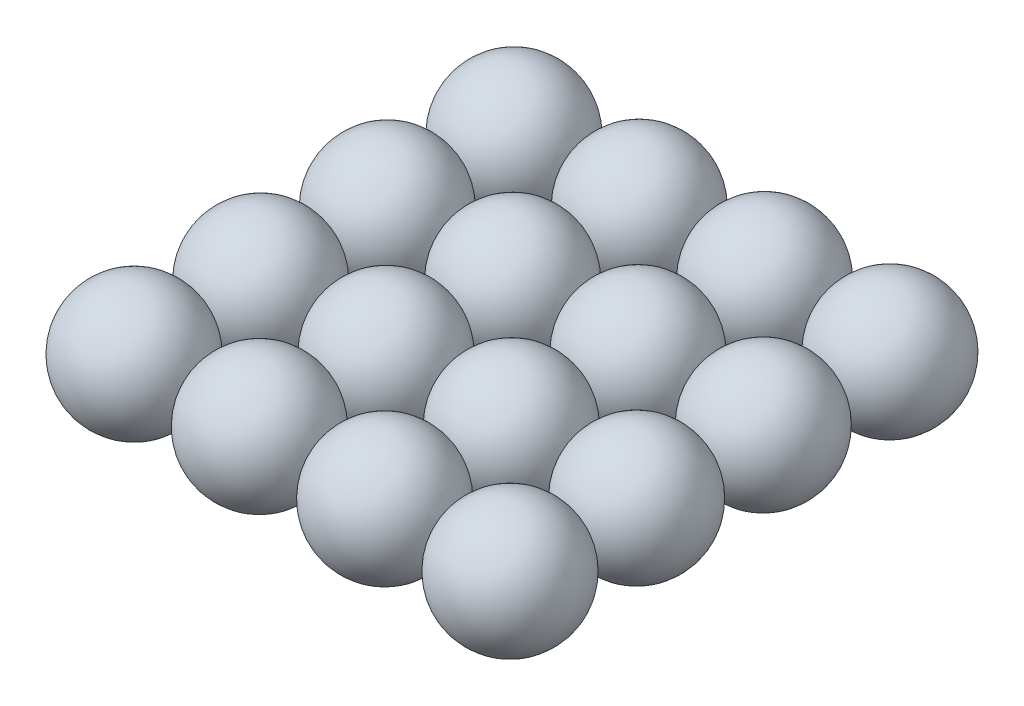
ISO-10303-21;
HEADER;
FILE_DESCRIPTION(('STEP AP214'),'2;1');
FILE_NAME('part.step','',(''),(''),'','','');
FILE_SCHEMA(('AUTOMOTIVE_DESIGN { 1 0 10303 214 1 1 1 1 }'));
ENDSEC;
DATA;
#1=APPLICATION_CONTEXT('core data for automotive mechanical design processes');
#2=APPLICATION_PROTOCOL_DEFINITION('international standard','automotive_design',2000,#1);
#3=PRODUCT_CONTEXT('',#1,'mechanical');
#4=PRODUCT('Part','Part','',(#3));
#5=PRODUCT_RELATED_PRODUCT_CATEGORY('part','',(#4));
#6=PRODUCT_DEFINITION_FORMATION('','',#4);
#7=PRODUCT_DEFINITION_CONTEXT('part definition',#1,'design');
#8=PRODUCT_DEFINITION('design','',#6,#7);
#9=PRODUCT_DEFINITION_SHAPE('','',#8);
#10=(LENGTH_UNIT() NAMED_UNIT(*) SI_UNIT(.MILLI.,.METRE.));
#11=(NAMED_UNIT(*) PLANE_ANGLE_UNIT() SI_UNIT($,.RADIAN.));
#12=(NAMED_UNIT(*) SI_UNIT($,.STERADIAN.) SOLID_ANGLE_UNIT());
#13=UNCERTAINTY_MEASURE_WITH_UNIT(LENGTH_MEASURE(1.E-05),#10,'distance_accuracy_value','');
#14=(GEOMETRIC_REPRESENTATION_CONTEXT(3) GLOBAL_UNCERTAINTY_ASSIGNED_CONTEXT((#13)) GLOBAL_UNIT_ASSIGNED_CONTEXT((#10,
#11,#12)) REPRESENTATION_CONTEXT('',''));
#15=CARTESIAN_POINT('',(0.,0.,0.));
#16=DIRECTION('',(0.,0.,1.));
#17=DIRECTION('',(1.,0.,0.));
#18=AXIS2_PLACEMENT_3D('',#15,#16,#17);
#19=CARTESIAN_POINT('',(573.,0.,0.));
#20=DIRECTION('',(0.,1.,0.));
#21=DIRECTION('',(1.,0.,0.));
#22=AXIS2_PLACEMENT_3D('',#19,#20,#21);
#23=SPHERICAL_SURFACE('',#22,95.);
#24=CARTESIAN_POINT('',(573.,95.,0.));
#25=VERTEX_POINT('',#24);
#26=VERTEX_LOOP('',#25);
#27=FACE_BOUND('',#26,.T.);
#28=ADVANCED_FACE('F50',(#27),#23,.T.);
#29=CLOSED_SHELL('',(#28));
#30=MANIFOLD_SOLID_BREP('B2',#29);
#31=CARTESIAN_POINT('',(382.,0.,0.));
#32=DIRECTION('',(0.,1.,0.));
#33=DIRECTION('',(1.,0.,0.));
#34=AXIS2_PLACEMENT_3D('',#31,#32,#33);
#35=SPHERICAL_SURFACE('',#34,95.);
#36=CARTESIAN_POINT('',(382.,95.,0.));
#37=VERTEX_POINT('',#36);
#38=VERTEX_LOOP('',#37);
#39=FACE_BOUND('',#38,.T.);
#40=ADVANCED_FACE('F75',(#39),#35,.T.);
#41=CLOSED_SHELL('',(#40));
#42=MANIFOLD_SOLID_BREP('B6',#41);
#43=CARTESIAN_POINT('',(191.,0.,0.));
#44=DIRECTION('',(0.,1.,0.));
#45=DIRECTION('',(1.,0.,0.));
#46=AXIS2_PLACEMENT_3D('',#43,#44,#45);
#47=SPHERICAL_SURFACE('',#46,95.);
#48=CARTESIAN_POINT('',(191.,95.,0.));
#49=VERTEX_POINT('',#48);
#50=VERTEX_LOOP('',#49);
#51=FACE_BOUND('',#50,.T.);
#52=ADVANCED_FACE('F100',(#51),#47,.T.);
#53=CLOSED_SHELL('',(#52));
#54=MANIFOLD_SOLID_BREP('B46',#53);
#55=CARTESIAN_POINT('',(573.,0.,-193.));
#56=DIRECTION('',(0.,1.,0.));
#57=DIRECTION('',(1.,0.,0.));
#58=AXIS2_PLACEMENT_3D('',#55,#56,#57);
#59=SPHERICAL_SURFACE('',#58,95.);
#60=CARTESIAN_POINT('',(573.,95.,-193.));
#61=VERTEX_POINT('',#60);
#62=VERTEX_LOOP('',#61);
#63=FACE_BOUND('',#62,.T.);
#64=ADVANCED_FACE('F125',(#63),#59,.T.);
#65=CLOSED_SHELL('',(#64));
#66=MANIFOLD_SOLID_BREP('B71',#65);
#67=CARTESIAN_POINT('',(382.,0.,-193.));
#68=DIRECTION('',(0.,1.,0.));
#69=DIRECTION('',(1.,0.,0.));
#70=AXIS2_PLACEMENT_3D('',#67,#68,#69);
#71=SPHERICAL_SURFACE('',#70,95.);
#72=CARTESIAN_POINT('',(382.,95.,-193.));
#73=VERTEX_POINT('',#72);
#74=VERTEX_LOOP('',#73);
#75=FACE_BOUND('',#74,.T.);
#76=ADVANCED_FACE('F150',(#75),#71,.T.);
#77=CLOSED_SHELL('',(#76));
#78=MANIFOLD_SOLID_BREP('B96',#77);
#79=CARTESIAN_POINT('',(191.,0.,-193.));
#80=DIRECTION('',(0.,1.,0.));
#81=DIRECTION('',(1.,0.,0.));
#82=AXIS2_PLACEMENT_3D('',#79,#80,#81);
#83=SPHERICAL_SURFACE('',#82,95.);
#84=CARTESIAN_POINT('',(191.,95.,-193.));
#85=VERTEX_POINT('',#84);
#86=VERTEX_LOOP('',#85);
#87=FACE_BOUND('',#86,.T.);
#88=ADVANCED_FACE('F175',(#87),#83,.T.);
#89=CLOSED_SHELL('',(#88));
#90=MANIFOLD_SOLID_BREP('B121',#89);
#91=CARTESIAN_POINT('',(573.,0.,-386.));
#92=DIRECTION('',(0.,1.,0.));
#93=DIRECTION('',(1.,0.,0.));
#94=AXIS2_PLACEMENT_3D('',#91,#92,#93);
#95=SPHERICAL_SURFACE('',#94,95.);
#96=CARTESIAN_POINT('',(573.,95.,-386.));
#97=VERTEX_POINT('',#96);
#98=VERTEX_LOOP('',#97);
#99=FACE_BOUND('',#98,.T.);
#100=ADVANCED_FACE('F200',(#99),#95,.T.);
#101=CLOSED_SHELL('',(#100));
#102=MANIFOLD_SOLID_BREP('B146',#101);
#103=CARTESIAN_POINT('',(382.,0.,-386.));
#104=DIRECTION('',(0.,1.,0.));
#105=DIRECTION('',(1.,0.,0.));
#106=AXIS2_PLACEMENT_3D('',#103,#104,#105);
#107=SPHERICAL_SURFACE('',#106,95.);
#108=CARTESIAN_POINT('',(382.,95.,-386.));
#109=VERTEX_POINT('',#108);
#110=VERTEX_LOOP('',#109);
#111=FACE_BOUND('',#110,.T.);
#112=ADVANCED_FACE('F225',(#111),#107,.T.);
#113=CLOSED_SHELL('',(#112));
#114=MANIFOLD_SOLID_BREP('B171',#113);
#115=CARTESIAN_POINT('',(191.,0.,-386.));
#116=DIRECTION('',(0.,1.,0.));
#117=DIRECTION('',(1.,0.,0.));
#118=AXIS2_PLACEMENT_3D('',#115,#116,#117);
#119=SPHERICAL_SURFACE('',#118,95.);
#120=CARTESIAN_POINT('',(191.,95.,-386.));
#121=VERTEX_POINT('',#120);
#122=VERTEX_LOOP('',#121);
#123=FACE_BOUND('',#122,.T.);
#124=ADVANCED_FACE('F250',(#123),#119,.T.);
#125=CLOSED_SHELL('',(#124));
#126=MANIFOLD_SOLID_BREP('B196',#125);
#127=CARTESIAN_POINT('',(573.,0.,-579.));
#128=DIRECTION('',(0.,1.,0.));
#129=DIRECTION('',(1.,0.,0.));
#130=AXIS2_PLACEMENT_3D('',#127,#128,#129);
#131=SPHERICAL_SURFACE('',#130,95.);
#132=CARTESIAN_POINT('',(573.,95.,-579.));
#133=VERTEX_POINT('',#132);
#134=VERTEX_LOOP('',#133);
#135=FACE_BOUND('',#134,.T.);
#136=ADVANCED_FACE('F275',(#135),#131,.T.);
#137=CLOSED_SHELL('',(#136));
#138=MANIFOLD_SOLID_BREP('B221',#137);
#139=CARTESIAN_POINT('',(382.,0.,-579.));
#140=DIRECTION('',(0.,1.,0.));
#141=DIRECTION('',(1.,0.,0.));
#142=AXIS2_PLACEMENT_3D('',#139,#140,#141);
#143=SPHERICAL_SURFACE('',#142,95.);
#144=CARTESIAN_POINT('',(382.,95.,-579.));
#145=VERTEX_POINT('',#144);
#146=VERTEX_LOOP('',#145);
#147=FACE_BOUND('',#146,.T.);
#148=ADVANCED_FACE('F300',(#147),#143,.T.);
#149=CLOSED_SHELL('',(#148));
#150=MANIFOLD_SOLID_BREP('B246',#149);
#151=CARTESIAN_POINT('',(191.,0.,-579.));
#152=DIRECTION('',(0.,1.,0.));
#153=DIRECTION('',(1.,0.,0.));
#154=AXIS2_PLACEMENT_3D('',#151,#152,#153);
#155=SPHERICAL_SURFACE('',#154,95.);
#156=CARTESIAN_POINT('',(191.,95.,-579.));
#157=VERTEX_POINT('',#156);
#158=VERTEX_LOOP('',#157);
#159=FACE_BOUND('',#158,.T.);
#160=ADVANCED_FACE('F325',(#159),#155,.T.);
#161=CLOSED_SHELL('',(#160));
#162=MANIFOLD_SOLID_BREP('B271',#161);
#163=CARTESIAN_POINT('',(0.,0.,-579.));
#164=DIRECTION('',(0.,1.,0.));
#165=DIRECTION('',(1.,0.,0.));
#166=AXIS2_PLACEMENT_3D('',#163,#164,#165);
#167=SPHERICAL_SURFACE('',#166,95.);
#168=CARTESIAN_POINT('',(0.,95.,-579.));
#169=VERTEX_POINT('',#168);
#170=VERTEX_LOOP('',#169);
#171=FACE_BOUND('',#170,.T.);
#172=ADVANCED_FACE('F350',(#171),#167,.T.);
#173=CLOSED_SHELL('',(#172));
#174=MANIFOLD_SOLID_BREP('B296',#173);
#175=CARTESIAN_POINT('',(0.,0.,-386.));
#176=DIRECTION('',(0.,1.,0.));
#177=DIRECTION('',(1.,0.,0.));
#178=AXIS2_PLACEMENT_3D('',#175,#176,#177);
#179=SPHERICAL_SURFACE('',#178,95.);
#180=CARTESIAN_POINT('',(0.,95.,-386.));
#181=VERTEX_POINT('',#180);
#182=VERTEX_LOOP('',#181);
#183=FACE_BOUND('',#182,.T.);
#184=ADVANCED_FACE('F375',(#183),#179,.T.);
#185=CLOSED_SHELL('',(#184));
#186=MANIFOLD_SOLID_BREP('B321',#185);
#187=CARTESIAN_POINT('',(0.,0.,-193.));
#188=DIRECTION('',(0.,1.,0.));
#189=DIRECTION('',(1.,0.,0.));
#190=AXIS2_PLACEMENT_3D('',#187,#188,#189);
#191=SPHERICAL_SURFACE('',#190,95.);
#192=CARTESIAN_POINT('',(0.,95.,-193.));
#193=VERTEX_POINT('',#192);
#194=VERTEX_LOOP('',#193);
#195=FACE_BOUND('',#194,.T.);
#196=ADVANCED_FACE('F399',(#195),#191,.T.);
#197=CLOSED_SHELL('',(#196));
#198=MANIFOLD_SOLID_BREP('B346',#197);
#199=CARTESIAN_POINT('',(0.,0.,0.));
#200=DIRECTION('',(0.,1.,0.));
#201=DIRECTION('',(1.,0.,0.));
#202=AXIS2_PLACEMENT_3D('',#199,#200,#201);
#203=SPHERICAL_SURFACE('',#202,95.);
#204=CARTESIAN_POINT('',(0.,95.,0.));
#205=VERTEX_POINT('',#204);
#206=VERTEX_LOOP('',#205);
#207=FACE_BOUND('',#206,.T.);
#208=ADVANCED_FACE('F418',(#207),#203,.T.);
#209=CLOSED_SHELL('',(#208));
#210=MANIFOLD_SOLID_BREP('B371',#209);
#211=ADVANCED_BREP_SHAPE_REPRESENTATION('',(#18,#30,#42,#54,#66,#78,#90,#102,#114,#126,#138,
#150,#162,#174,#186,#198,#210),#14);
#212=SHAPE_DEFINITION_REPRESENTATION(#9,#211);
ENDSEC;
END-ISO-10303-21;
